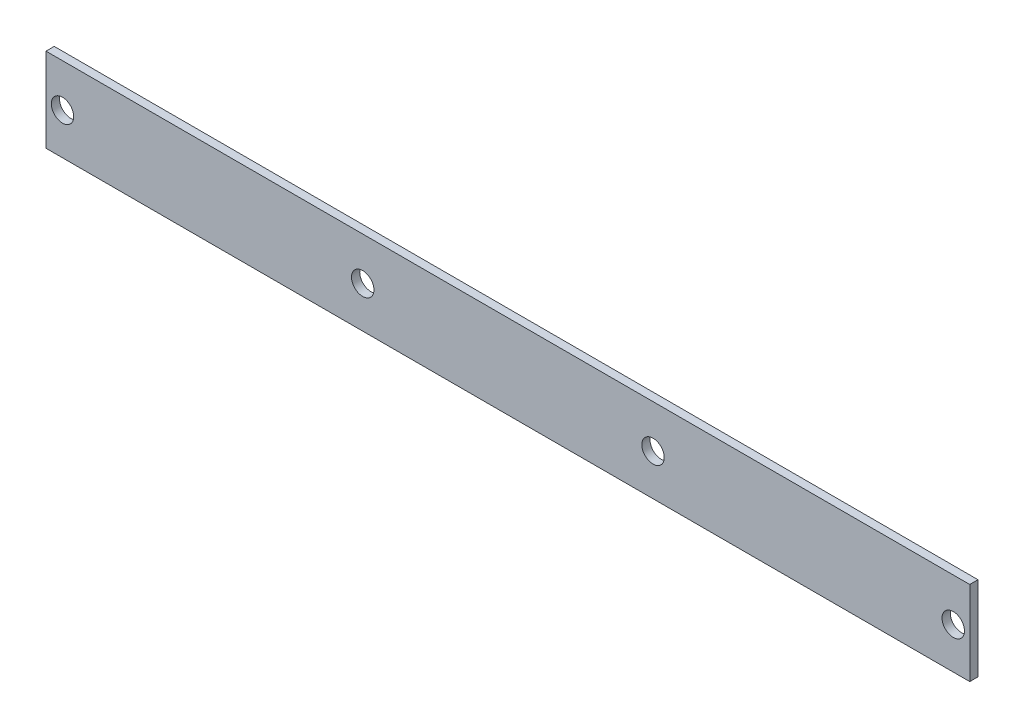
ISO-10303-21;
HEADER;
FILE_DESCRIPTION(('STEP AP214'),'2;1');
FILE_NAME('part.step','',(''),(''),'','','');
FILE_SCHEMA(('AUTOMOTIVE_DESIGN { 1 0 10303 214 1 1 1 1 }'));
ENDSEC;
DATA;
#1=APPLICATION_CONTEXT('core data for automotive mechanical design processes');
#2=APPLICATION_PROTOCOL_DEFINITION('international standard','automotive_design',2000,#1);
#3=PRODUCT_CONTEXT('',#1,'mechanical');
#4=PRODUCT('Part','Part','',(#3));
#5=PRODUCT_RELATED_PRODUCT_CATEGORY('part','',(#4));
#6=PRODUCT_DEFINITION_FORMATION('','',#4);
#7=PRODUCT_DEFINITION_CONTEXT('part definition',#1,'design');
#8=PRODUCT_DEFINITION('design','',#6,#7);
#9=PRODUCT_DEFINITION_SHAPE('','',#8);
#10=(LENGTH_UNIT() NAMED_UNIT(*) SI_UNIT(.MILLI.,.METRE.));
#11=(NAMED_UNIT(*) PLANE_ANGLE_UNIT() SI_UNIT($,.RADIAN.));
#12=(NAMED_UNIT(*) SI_UNIT($,.STERADIAN.) SOLID_ANGLE_UNIT());
#13=UNCERTAINTY_MEASURE_WITH_UNIT(LENGTH_MEASURE(1.E-05),#10,'distance_accuracy_value','');
#14=(GEOMETRIC_REPRESENTATION_CONTEXT(3) GLOBAL_UNCERTAINTY_ASSIGNED_CONTEXT((#13)) GLOBAL_UNIT_ASSIGNED_CONTEXT((#10,
#11,#12)) REPRESENTATION_CONTEXT('',''));
#15=CARTESIAN_POINT('',(0.,0.,0.));
#16=DIRECTION('',(0.,0.,1.));
#17=DIRECTION('',(1.,0.,0.));
#18=AXIS2_PLACEMENT_3D('',#15,#16,#17);
#19=CARTESIAN_POINT('',(0.,0.,2.5));
#20=DIRECTION('',(0.,0.,1.));
#21=DIRECTION('',(1.,0.,0.));
#22=AXIS2_PLACEMENT_3D('',#19,#20,#21);
#23=PLANE('',#22);
#24=CARTESIAN_POINT('',(-135.,0.,2.5));
#25=DIRECTION('',(0.,0.,1.));
#26=DIRECTION('',(-1.,0.,0.));
#27=AXIS2_PLACEMENT_3D('',#24,#25,#26);
#28=CIRCLE('',#27,3.4);
#29=CARTESIAN_POINT('',(-138.4,0.,2.5));
#30=VERTEX_POINT('',#29);
#31=EDGE_CURVE('E141',#30,#30,#28,.T.);
#32=ORIENTED_EDGE('',*,*,#31,.F.);
#33=EDGE_LOOP('',(#32));
#34=FACE_BOUND('',#33,.T.);
#35=CARTESIAN_POINT('',(135.,0.,2.5));
#36=DIRECTION('',(0.,0.,1.));
#37=DIRECTION('',(1.,0.,0.));
#38=AXIS2_PLACEMENT_3D('',#35,#36,#37);
#39=CIRCLE('',#38,3.4);
#40=CARTESIAN_POINT('',(138.4,0.,2.5));
#41=VERTEX_POINT('',#40);
#42=EDGE_CURVE('E112',#41,#41,#39,.T.);
#43=ORIENTED_EDGE('',*,*,#42,.F.);
#44=EDGE_LOOP('',(#43));
#45=FACE_BOUND('',#44,.T.);
#46=DIRECTION('',(0.,-1.,0.));
#47=VECTOR('',#46,1.);
#48=CARTESIAN_POINT('',(-140.,13.,2.5));
#49=LINE('',#48,#47);
#50=CARTESIAN_POINT('',(-140.,13.,2.5));
#51=VERTEX_POINT('',#50);
#52=CARTESIAN_POINT('',(-140.,-12.5,2.5));
#53=VERTEX_POINT('',#52);
#54=EDGE_CURVE('E90',#51,#53,#49,.T.);
#55=ORIENTED_EDGE('',*,*,#54,.T.);
#56=DIRECTION('',(1.,0.,0.));
#57=VECTOR('',#56,1.);
#58=CARTESIAN_POINT('',(-140.,-12.5,2.5));
#59=LINE('',#58,#57);
#60=CARTESIAN_POINT('',(140.,-12.5,2.5));
#61=VERTEX_POINT('',#60);
#62=EDGE_CURVE('E85',#53,#61,#59,.T.);
#63=ORIENTED_EDGE('',*,*,#62,.T.);
#64=DIRECTION('',(0.,1.,0.));
#65=VECTOR('',#64,1.);
#66=CARTESIAN_POINT('',(140.,13.,2.5));
#67=LINE('',#66,#65);
#68=CARTESIAN_POINT('',(140.,13.,2.5));
#69=VERTEX_POINT('',#68);
#70=EDGE_CURVE('E88',#61,#69,#67,.T.);
#71=ORIENTED_EDGE('',*,*,#70,.T.);
#72=DIRECTION('',(-1.,0.,0.));
#73=VECTOR('',#72,1.);
#74=CARTESIAN_POINT('',(-140.,13.,2.5));
#75=LINE('',#74,#73);
#76=EDGE_CURVE('E55',#69,#51,#75,.T.);
#77=ORIENTED_EDGE('',*,*,#76,.T.);
#78=EDGE_LOOP('',(#55,#63,#71,#77));
#79=FACE_BOUND('',#78,.T.);
#80=CARTESIAN_POINT('',(44.,-6.69127390646003E-13,2.5));
#81=DIRECTION('',(0.,0.,1.));
#82=DIRECTION('',(1.,0.,0.));
#83=AXIS2_PLACEMENT_3D('',#80,#81,#82);
#84=CIRCLE('',#83,3.4);
#85=CARTESIAN_POINT('',(47.4,-6.69127390646003E-13,2.5));
#86=VERTEX_POINT('',#85);
#87=EDGE_CURVE('E133',#86,#86,#84,.T.);
#88=ORIENTED_EDGE('',*,*,#87,.F.);
#89=EDGE_LOOP('',(#88));
#90=FACE_BOUND('',#89,.T.);
#91=CARTESIAN_POINT('',(-44.,-6.69127390646003E-13,2.5));
#92=DIRECTION('',(0.,0.,1.));
#93=DIRECTION('',(-1.,0.,0.));
#94=AXIS2_PLACEMENT_3D('',#91,#92,#93);
#95=CIRCLE('',#94,3.4);
#96=CARTESIAN_POINT('',(-47.4,-6.69127390646003E-13,2.5));
#97=VERTEX_POINT('',#96);
#98=EDGE_CURVE('E149',#97,#97,#95,.T.);
#99=ORIENTED_EDGE('',*,*,#98,.F.);
#100=EDGE_LOOP('',(#99));
#101=FACE_BOUND('',#100,.T.);
#102=ADVANCED_FACE('F37',(#34,#45,#79,#90,#101),#23,.T.);
#103=CARTESIAN_POINT('',(0.,0.,0.));
#104=DIRECTION('',(0.,0.,1.));
#105=DIRECTION('',(1.,0.,0.));
#106=AXIS2_PLACEMENT_3D('',#103,#104,#105);
#107=PLANE('',#106);
#108=DIRECTION('',(0.,-1.,0.));
#109=VECTOR('',#108,1.);
#110=CARTESIAN_POINT('',(-140.,13.,0.));
#111=LINE('',#110,#109);
#112=CARTESIAN_POINT('',(-140.,13.,0.));
#113=VERTEX_POINT('',#112);
#114=CARTESIAN_POINT('',(-140.,-12.5,0.));
#115=VERTEX_POINT('',#114);
#116=EDGE_CURVE('E108',#113,#115,#111,.T.);
#117=ORIENTED_EDGE('',*,*,#116,.F.);
#118=DIRECTION('',(-1.,0.,0.));
#119=VECTOR('',#118,1.);
#120=CARTESIAN_POINT('',(-140.,13.,0.));
#121=LINE('',#120,#119);
#122=CARTESIAN_POINT('',(140.,13.,0.));
#123=VERTEX_POINT('',#122);
#124=EDGE_CURVE('E78',#123,#113,#121,.T.);
#125=ORIENTED_EDGE('',*,*,#124,.F.);
#126=DIRECTION('',(0.,1.,0.));
#127=VECTOR('',#126,1.);
#128=CARTESIAN_POINT('',(140.,13.,0.));
#129=LINE('',#128,#127);
#130=CARTESIAN_POINT('',(140.,-12.5,0.));
#131=VERTEX_POINT('',#130);
#132=EDGE_CURVE('E72',#131,#123,#129,.T.);
#133=ORIENTED_EDGE('',*,*,#132,.F.);
#134=DIRECTION('',(1.,0.,0.));
#135=VECTOR('',#134,1.);
#136=CARTESIAN_POINT('',(-140.,-12.5,0.));
#137=LINE('',#136,#135);
#138=EDGE_CURVE('E95',#115,#131,#137,.T.);
#139=ORIENTED_EDGE('',*,*,#138,.F.);
#140=EDGE_LOOP('',(#117,#125,#133,#139));
#141=FACE_BOUND('',#140,.T.);
#142=CARTESIAN_POINT('',(135.,0.,0.));
#143=DIRECTION('',(0.,0.,1.));
#144=DIRECTION('',(1.,0.,0.));
#145=AXIS2_PLACEMENT_3D('',#142,#143,#144);
#146=CIRCLE('',#145,3.4);
#147=CARTESIAN_POINT('',(138.4,0.,0.));
#148=VERTEX_POINT('',#147);
#149=EDGE_CURVE('E129',#148,#148,#146,.T.);
#150=ORIENTED_EDGE('',*,*,#149,.T.);
#151=EDGE_LOOP('',(#150));
#152=FACE_BOUND('',#151,.T.);
#153=CARTESIAN_POINT('',(44.,-6.69127390646003E-13,0.));
#154=DIRECTION('',(0.,0.,1.));
#155=DIRECTION('',(1.,0.,0.));
#156=AXIS2_PLACEMENT_3D('',#153,#154,#155);
#157=CIRCLE('',#156,3.4);
#158=CARTESIAN_POINT('',(47.4,-6.69127390646003E-13,0.));
#159=VERTEX_POINT('',#158);
#160=EDGE_CURVE('E137',#159,#159,#157,.T.);
#161=ORIENTED_EDGE('',*,*,#160,.T.);
#162=EDGE_LOOP('',(#161));
#163=FACE_BOUND('',#162,.T.);
#164=CARTESIAN_POINT('',(-135.,0.,0.));
#165=DIRECTION('',(0.,0.,1.));
#166=DIRECTION('',(-1.,0.,0.));
#167=AXIS2_PLACEMENT_3D('',#164,#165,#166);
#168=CIRCLE('',#167,3.4);
#169=CARTESIAN_POINT('',(-138.4,0.,0.));
#170=VERTEX_POINT('',#169);
#171=EDGE_CURVE('E145',#170,#170,#168,.T.);
#172=ORIENTED_EDGE('',*,*,#171,.T.);
#173=EDGE_LOOP('',(#172));
#174=FACE_BOUND('',#173,.T.);
#175=CARTESIAN_POINT('',(-44.,-6.69127390646003E-13,0.));
#176=DIRECTION('',(0.,0.,1.));
#177=DIRECTION('',(-1.,0.,0.));
#178=AXIS2_PLACEMENT_3D('',#175,#176,#177);
#179=CIRCLE('',#178,3.4);
#180=CARTESIAN_POINT('',(-47.4,-6.69127390646003E-13,0.));
#181=VERTEX_POINT('',#180);
#182=EDGE_CURVE('E153',#181,#181,#179,.T.);
#183=ORIENTED_EDGE('',*,*,#182,.T.);
#184=EDGE_LOOP('',(#183));
#185=FACE_BOUND('',#184,.T.);
#186=ADVANCED_FACE('F123',(#141,#152,#163,#174,#185),#107,.F.);
#187=CARTESIAN_POINT('',(-140.,13.,2.5));
#188=DIRECTION('',(1.,0.,0.));
#189=DIRECTION('',(0.,0.,-1.));
#190=AXIS2_PLACEMENT_3D('',#187,#188,#189);
#191=PLANE('',#190);
#192=ORIENTED_EDGE('',*,*,#116,.T.);
#193=DIRECTION('',(0.,0.,-1.));
#194=VECTOR('',#193,1.);
#195=CARTESIAN_POINT('',(-140.,-12.5,2.5));
#196=LINE('',#195,#194);
#197=EDGE_CURVE('E11',#53,#115,#196,.T.);
#198=ORIENTED_EDGE('',*,*,#197,.F.);
#199=ORIENTED_EDGE('',*,*,#54,.F.);
#200=DIRECTION('',(0.,0.,-1.));
#201=VECTOR('',#200,1.);
#202=CARTESIAN_POINT('',(-140.,13.,2.5));
#203=LINE('',#202,#201);
#204=EDGE_CURVE('E104',#51,#113,#203,.T.);
#205=ORIENTED_EDGE('',*,*,#204,.T.);
#206=EDGE_LOOP('',(#192,#198,#199,#205));
#207=FACE_BOUND('',#206,.T.);
#208=ADVANCED_FACE('F39',(#207),#191,.F.);
#209=CARTESIAN_POINT('',(-140.,-12.5,2.5));
#210=DIRECTION('',(0.,1.,0.));
#211=DIRECTION('',(0.,0.,1.));
#212=AXIS2_PLACEMENT_3D('',#209,#210,#211);
#213=PLANE('',#212);
#214=ORIENTED_EDGE('',*,*,#138,.T.);
#215=DIRECTION('',(0.,0.,-1.));
#216=VECTOR('',#215,1.);
#217=CARTESIAN_POINT('',(140.,-12.5,2.5));
#218=LINE('',#217,#216);
#219=EDGE_CURVE('E47',#61,#131,#218,.T.);
#220=ORIENTED_EDGE('',*,*,#219,.F.);
#221=ORIENTED_EDGE('',*,*,#62,.F.);
#222=ORIENTED_EDGE('',*,*,#197,.T.);
#223=EDGE_LOOP('',(#214,#220,#221,#222));
#224=FACE_BOUND('',#223,.T.);
#225=ADVANCED_FACE('F94',(#224),#213,.F.);
#226=CARTESIAN_POINT('',(140.,13.,2.5));
#227=DIRECTION('',(-1.,0.,0.));
#228=DIRECTION('',(0.,0.,1.));
#229=AXIS2_PLACEMENT_3D('',#226,#227,#228);
#230=PLANE('',#229);
#231=ORIENTED_EDGE('',*,*,#132,.T.);
#232=DIRECTION('',(0.,0.,-1.));
#233=VECTOR('',#232,1.);
#234=CARTESIAN_POINT('',(140.,13.,2.5));
#235=LINE('',#234,#233);
#236=EDGE_CURVE('E97',#69,#123,#235,.T.);
#237=ORIENTED_EDGE('',*,*,#236,.F.);
#238=ORIENTED_EDGE('',*,*,#70,.F.);
#239=ORIENTED_EDGE('',*,*,#219,.T.);
#240=EDGE_LOOP('',(#231,#237,#238,#239));
#241=FACE_BOUND('',#240,.T.);
#242=ADVANCED_FACE('F98',(#241),#230,.F.);
#243=CARTESIAN_POINT('',(-140.,13.,2.5));
#244=DIRECTION('',(0.,-1.,0.));
#245=DIRECTION('',(0.,0.,-1.));
#246=AXIS2_PLACEMENT_3D('',#243,#244,#245);
#247=PLANE('',#246);
#248=ORIENTED_EDGE('',*,*,#124,.T.);
#249=ORIENTED_EDGE('',*,*,#204,.F.);
#250=ORIENTED_EDGE('',*,*,#76,.F.);
#251=ORIENTED_EDGE('',*,*,#236,.T.);
#252=EDGE_LOOP('',(#248,#249,#250,#251));
#253=FACE_BOUND('',#252,.T.);
#254=ADVANCED_FACE('F120',(#253),#247,.F.);
#255=CARTESIAN_POINT('',(135.,0.,2.5));
#256=DIRECTION('',(0.,0.,-1.));
#257=DIRECTION('',(-1.,0.,0.));
#258=AXIS2_PLACEMENT_3D('',#255,#256,#257);
#259=CYLINDRICAL_SURFACE('',#258,3.4);
#260=ORIENTED_EDGE('',*,*,#42,.T.);
#261=EDGE_LOOP('',(#260));
#262=FACE_BOUND('',#261,.T.);
#263=ORIENTED_EDGE('',*,*,#149,.F.);
#264=EDGE_LOOP('',(#263));
#265=FACE_BOUND('',#264,.T.);
#266=ADVANCED_FACE('F173',(#262,#265),#259,.F.);
#267=CARTESIAN_POINT('',(44.,-6.69127390646003E-13,2.5));
#268=DIRECTION('',(0.,0.,-1.));
#269=DIRECTION('',(-1.,0.,0.));
#270=AXIS2_PLACEMENT_3D('',#267,#268,#269);
#271=CYLINDRICAL_SURFACE('',#270,3.4);
#272=ORIENTED_EDGE('',*,*,#87,.T.);
#273=EDGE_LOOP('',(#272));
#274=FACE_BOUND('',#273,.T.);
#275=ORIENTED_EDGE('',*,*,#160,.F.);
#276=EDGE_LOOP('',(#275));
#277=FACE_BOUND('',#276,.T.);
#278=ADVANCED_FACE('F225',(#274,#277),#271,.F.);
#279=CARTESIAN_POINT('',(-135.,0.,2.5));
#280=DIRECTION('',(0.,0.,-1.));
#281=DIRECTION('',(-1.,0.,0.));
#282=AXIS2_PLACEMENT_3D('',#279,#280,#281);
#283=CYLINDRICAL_SURFACE('',#282,3.4);
#284=ORIENTED_EDGE('',*,*,#31,.T.);
#285=EDGE_LOOP('',(#284));
#286=FACE_BOUND('',#285,.T.);
#287=ORIENTED_EDGE('',*,*,#171,.F.);
#288=EDGE_LOOP('',(#287));
#289=FACE_BOUND('',#288,.T.);
#290=ADVANCED_FACE('F234',(#286,#289),#283,.F.);
#291=CARTESIAN_POINT('',(-44.,-6.69127390646003E-13,2.5));
#292=DIRECTION('',(0.,0.,-1.));
#293=DIRECTION('',(-1.,0.,0.));
#294=AXIS2_PLACEMENT_3D('',#291,#292,#293);
#295=CYLINDRICAL_SURFACE('',#294,3.4);
#296=ORIENTED_EDGE('',*,*,#98,.T.);
#297=EDGE_LOOP('',(#296));
#298=FACE_BOUND('',#297,.T.);
#299=ORIENTED_EDGE('',*,*,#182,.F.);
#300=EDGE_LOOP('',(#299));
#301=FACE_BOUND('',#300,.T.);
#302=ADVANCED_FACE('F160',(#298,#301),#295,.F.);
#303=CLOSED_SHELL('',(#102,#186,#208,#225,#242,#254,#266,#278,#290,#302));
#304=MANIFOLD_SOLID_BREP('B2',#303);
#305=ADVANCED_BREP_SHAPE_REPRESENTATION('',(#18,#304),#14);
#306=SHAPE_DEFINITION_REPRESENTATION(#9,#305);
ENDSEC;
END-ISO-10303-21;
